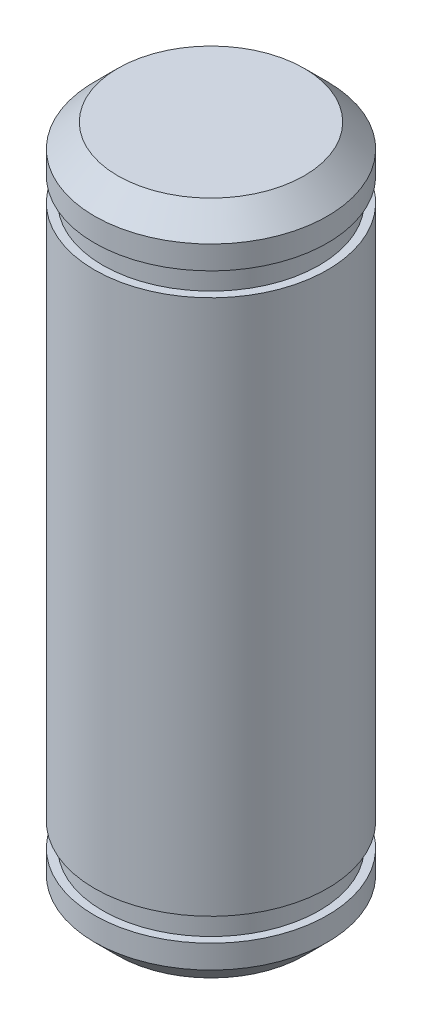
ISO-10303-21;
HEADER;
FILE_DESCRIPTION(('STEP AP214'),'2;1');
FILE_NAME('part.step','',(''),(''),'','','');
FILE_SCHEMA(('AUTOMOTIVE_DESIGN { 1 0 10303 214 1 1 1 1 }'));
ENDSEC;
DATA;
#1=APPLICATION_CONTEXT('core data for automotive mechanical design processes');
#2=APPLICATION_PROTOCOL_DEFINITION('international standard','automotive_design',2000,#1);
#3=PRODUCT_CONTEXT('',#1,'mechanical');
#4=PRODUCT('Part','Part','',(#3));
#5=PRODUCT_RELATED_PRODUCT_CATEGORY('part','',(#4));
#6=PRODUCT_DEFINITION_FORMATION('','',#4);
#7=PRODUCT_DEFINITION_CONTEXT('part definition',#1,'design');
#8=PRODUCT_DEFINITION('design','',#6,#7);
#9=PRODUCT_DEFINITION_SHAPE('','',#8);
#10=(LENGTH_UNIT() NAMED_UNIT(*) SI_UNIT(.MILLI.,.METRE.));
#11=(NAMED_UNIT(*) PLANE_ANGLE_UNIT() SI_UNIT($,.RADIAN.));
#12=(NAMED_UNIT(*) SI_UNIT($,.STERADIAN.) SOLID_ANGLE_UNIT());
#13=UNCERTAINTY_MEASURE_WITH_UNIT(LENGTH_MEASURE(1.E-05),#10,'distance_accuracy_value','');
#14=(GEOMETRIC_REPRESENTATION_CONTEXT(3) GLOBAL_UNCERTAINTY_ASSIGNED_CONTEXT((#13)) GLOBAL_UNIT_ASSIGNED_CONTEXT((#10,
#11,#12)) REPRESENTATION_CONTEXT('',''));
#15=CARTESIAN_POINT('',(0.,0.,0.));
#16=DIRECTION('',(0.,0.,1.));
#17=DIRECTION('',(1.,0.,0.));
#18=AXIS2_PLACEMENT_3D('',#15,#16,#17);
#19=CARTESIAN_POINT('',(0.,23.0736880055133,0.));
#20=DIRECTION('',(0.,1.,0.));
#21=DIRECTION('',(0.,0.,1.));
#22=AXIS2_PLACEMENT_3D('',#19,#20,#21);
#23=CYLINDRICAL_SURFACE('',#22,5.00000000000001);
#24=CARTESIAN_POINT('',(0.,13.,0.));
#25=DIRECTION('',(0.,1.,0.));
#26=DIRECTION('',(0.,0.,1.));
#27=AXIS2_PLACEMENT_3D('',#24,#25,#26);
#28=CIRCLE('',#27,5.00000000000001);
#29=CARTESIAN_POINT('',(0.,13.,5.00000000000001));
#30=VERTEX_POINT('',#29);
#31=EDGE_CURVE('E56',#30,#30,#28,.T.);
#32=ORIENTED_EDGE('',*,*,#31,.F.);
#33=EDGE_LOOP('',(#32));
#34=FACE_BOUND('',#33,.T.);
#35=CARTESIAN_POINT('',(0.,-10.,0.));
#36=DIRECTION('',(0.,1.,0.));
#37=DIRECTION('',(0.,0.,1.));
#38=AXIS2_PLACEMENT_3D('',#35,#36,#37);
#39=CIRCLE('',#38,5.00000000000001);
#40=CARTESIAN_POINT('',(0.,-10.,5.00000000000001));
#41=VERTEX_POINT('',#40);
#42=EDGE_CURVE('E66',#41,#41,#39,.T.);
#43=ORIENTED_EDGE('',*,*,#42,.T.);
#44=EDGE_LOOP('',(#43));
#45=FACE_BOUND('',#44,.T.);
#46=ADVANCED_FACE('F35',(#34,#45),#23,.T.);
#47=CARTESIAN_POINT('',(0.,13.,0.));
#48=DIRECTION('',(0.,1.,0.));
#49=DIRECTION('',(0.,0.,1.));
#50=AXIS2_PLACEMENT_3D('',#47,#48,#49);
#51=PLANE('',#50);
#52=CARTESIAN_POINT('',(0.,13.,0.));
#53=DIRECTION('',(0.,1.,0.));
#54=DIRECTION('',(0.,0.,1.));
#55=AXIS2_PLACEMENT_3D('',#52,#53,#54);
#56=CIRCLE('',#55,4.65);
#57=CARTESIAN_POINT('',(0.,13.,4.65));
#58=VERTEX_POINT('',#57);
#59=EDGE_CURVE('E60',#58,#58,#56,.T.);
#60=ORIENTED_EDGE('',*,*,#59,.F.);
#61=EDGE_LOOP('',(#60));
#62=FACE_BOUND('',#61,.T.);
#63=ORIENTED_EDGE('',*,*,#31,.T.);
#64=EDGE_LOOP('',(#63));
#65=FACE_BOUND('',#64,.T.);
#66=ADVANCED_FACE('F102',(#62,#65),#51,.T.);
#67=CARTESIAN_POINT('',(0.,14.,0.));
#68=DIRECTION('',(0.,1.,0.));
#69=DIRECTION('',(0.,0.,1.));
#70=AXIS2_PLACEMENT_3D('',#67,#68,#69);
#71=PLANE('',#70);
#72=CARTESIAN_POINT('',(0.,14.,0.));
#73=DIRECTION('',(0.,1.,0.));
#74=DIRECTION('',(0.,0.,1.));
#75=AXIS2_PLACEMENT_3D('',#72,#73,#74);
#76=CIRCLE('',#75,4.65);
#77=CARTESIAN_POINT('',(0.,14.,4.65));
#78=VERTEX_POINT('',#77);
#79=EDGE_CURVE('E63',#78,#78,#76,.T.);
#80=ORIENTED_EDGE('',*,*,#79,.T.);
#81=EDGE_LOOP('',(#80));
#82=FACE_BOUND('',#81,.T.);
#83=CARTESIAN_POINT('',(0.,14.,0.));
#84=DIRECTION('',(0.,1.,0.));
#85=DIRECTION('',(0.,0.,1.));
#86=AXIS2_PLACEMENT_3D('',#83,#84,#85);
#87=CIRCLE('',#86,5.00000000000001);
#88=CARTESIAN_POINT('',(0.,14.,5.00000000000001));
#89=VERTEX_POINT('',#88);
#90=EDGE_CURVE('E57',#89,#89,#87,.T.);
#91=ORIENTED_EDGE('',*,*,#90,.F.);
#92=EDGE_LOOP('',(#91));
#93=FACE_BOUND('',#92,.T.);
#94=ADVANCED_FACE('F109',(#82,#93),#71,.F.);
#95=CARTESIAN_POINT('',(0.,13.,0.));
#96=DIRECTION('',(0.,1.,0.));
#97=DIRECTION('',(0.,0.,1.));
#98=AXIS2_PLACEMENT_3D('',#95,#96,#97);
#99=CYLINDRICAL_SURFACE('',#98,4.65);
#100=ORIENTED_EDGE('',*,*,#59,.T.);
#101=EDGE_LOOP('',(#100));
#102=FACE_BOUND('',#101,.T.);
#103=ORIENTED_EDGE('',*,*,#79,.F.);
#104=EDGE_LOOP('',(#103));
#105=FACE_BOUND('',#104,.T.);
#106=ADVANCED_FACE('F132',(#102,#105),#99,.T.);
#107=CARTESIAN_POINT('',(0.,16.,0.));
#108=DIRECTION('',(0.,-1.,0.));
#109=DIRECTION('',(0.,0.,-1.));
#110=AXIS2_PLACEMENT_3D('',#107,#108,#109);
#111=PLANE('',#110);
#112=CARTESIAN_POINT('',(0.,16.,0.));
#113=DIRECTION('',(0.,-1.,0.));
#114=DIRECTION('',(0.,0.,-1.));
#115=AXIS2_PLACEMENT_3D('',#112,#113,#114);
#116=CIRCLE('',#115,4.00000000000001);
#117=CARTESIAN_POINT('',(0.,16.,-4.00000000000001));
#118=VERTEX_POINT('',#117);
#119=EDGE_CURVE('E10',#118,#118,#116,.F.);
#120=ORIENTED_EDGE('',*,*,#119,.T.);
#121=EDGE_LOOP('',(#120));
#122=FACE_BOUND('',#121,.T.);
#123=ADVANCED_FACE('F124',(#122),#111,.F.);
#124=CARTESIAN_POINT('',(0.,16.,0.));
#125=DIRECTION('',(0.,-1.,0.));
#126=DIRECTION('',(0.,0.,-1.));
#127=AXIS2_PLACEMENT_3D('',#124,#125,#126);
#128=CONICAL_SURFACE('',#127,4.00000000000001,0.785398163397449);
#129=CARTESIAN_POINT('',(0.,15.,0.));
#130=DIRECTION('',(0.,-1.,0.));
#131=DIRECTION('',(0.,0.,-1.));
#132=AXIS2_PLACEMENT_3D('',#129,#130,#131);
#133=CIRCLE('',#132,5.00000000000001);
#134=CARTESIAN_POINT('',(0.,15.,-5.00000000000001));
#135=VERTEX_POINT('',#134);
#136=EDGE_CURVE('E51',#135,#135,#133,.T.);
#137=ORIENTED_EDGE('',*,*,#136,.F.);
#138=EDGE_LOOP('',(#137));
#139=FACE_BOUND('',#138,.T.);
#140=ORIENTED_EDGE('',*,*,#119,.F.);
#141=EDGE_LOOP('',(#140));
#142=FACE_BOUND('',#141,.T.);
#143=ADVANCED_FACE('F38',(#139,#142),#128,.T.);
#144=ORIENTED_EDGE('',*,*,#90,.T.);
#145=EDGE_LOOP('',(#144));
#146=FACE_BOUND('',#145,.T.);
#147=ORIENTED_EDGE('',*,*,#136,.T.);
#148=EDGE_LOOP('',(#147));
#149=FACE_BOUND('',#148,.T.);
#150=ADVANCED_FACE('F97',(#146,#149),#23,.T.);
#151=CARTESIAN_POINT('',(0.,-10.,0.));
#152=DIRECTION('',(0.,-1.,0.));
#153=DIRECTION('',(0.,0.,1.));
#154=AXIS2_PLACEMENT_3D('',#151,#152,#153);
#155=PLANE('',#154);
#156=ORIENTED_EDGE('',*,*,#42,.F.);
#157=EDGE_LOOP('',(#156));
#158=FACE_BOUND('',#157,.T.);
#159=CARTESIAN_POINT('',(0.,-10.,0.));
#160=DIRECTION('',(0.,1.,0.));
#161=DIRECTION('',(0.,0.,1.));
#162=AXIS2_PLACEMENT_3D('',#159,#160,#161);
#163=CIRCLE('',#162,4.65);
#164=CARTESIAN_POINT('',(0.,-10.,4.65));
#165=VERTEX_POINT('',#164);
#166=EDGE_CURVE('E72',#165,#165,#163,.T.);
#167=ORIENTED_EDGE('',*,*,#166,.T.);
#168=EDGE_LOOP('',(#167));
#169=FACE_BOUND('',#168,.T.);
#170=ADVANCED_FACE('F81',(#158,#169),#155,.T.);
#171=CARTESIAN_POINT('',(0.,-11.,0.));
#172=DIRECTION('',(0.,-1.,0.));
#173=DIRECTION('',(0.,0.,1.));
#174=AXIS2_PLACEMENT_3D('',#171,#172,#173);
#175=PLANE('',#174);
#176=CARTESIAN_POINT('',(0.,-11.,0.));
#177=DIRECTION('',(0.,1.,0.));
#178=DIRECTION('',(0.,0.,1.));
#179=AXIS2_PLACEMENT_3D('',#176,#177,#178);
#180=CIRCLE('',#179,5.00000000000001);
#181=CARTESIAN_POINT('',(0.,-11.,5.00000000000001));
#182=VERTEX_POINT('',#181);
#183=EDGE_CURVE('E69',#182,#182,#180,.T.);
#184=ORIENTED_EDGE('',*,*,#183,.T.);
#185=EDGE_LOOP('',(#184));
#186=FACE_BOUND('',#185,.T.);
#187=CARTESIAN_POINT('',(0.,-11.,0.));
#188=DIRECTION('',(0.,1.,0.));
#189=DIRECTION('',(0.,0.,1.));
#190=AXIS2_PLACEMENT_3D('',#187,#188,#189);
#191=CIRCLE('',#190,4.65);
#192=CARTESIAN_POINT('',(0.,-11.,4.65));
#193=VERTEX_POINT('',#192);
#194=EDGE_CURVE('E75',#193,#193,#191,.T.);
#195=ORIENTED_EDGE('',*,*,#194,.F.);
#196=EDGE_LOOP('',(#195));
#197=FACE_BOUND('',#196,.T.);
#198=ADVANCED_FACE('F87',(#186,#197),#175,.F.);
#199=CARTESIAN_POINT('',(0.,-10.,0.));
#200=DIRECTION('',(0.,-1.,0.));
#201=DIRECTION('',(0.,0.,-1.));
#202=AXIS2_PLACEMENT_3D('',#199,#200,#201);
#203=CYLINDRICAL_SURFACE('',#202,4.65);
#204=ORIENTED_EDGE('',*,*,#166,.F.);
#205=EDGE_LOOP('',(#204));
#206=FACE_BOUND('',#205,.T.);
#207=ORIENTED_EDGE('',*,*,#194,.T.);
#208=EDGE_LOOP('',(#207));
#209=FACE_BOUND('',#208,.T.);
#210=ADVANCED_FACE('F83',(#206,#209),#203,.T.);
#211=CARTESIAN_POINT('',(5.00000000000001,-13.,0.));
#212=DIRECTION('',(0.,1.,0.));
#213=DIRECTION('',(0.,0.,1.));
#214=AXIS2_PLACEMENT_3D('',#211,#212,#213);
#215=PLANE('',#214);
#216=CARTESIAN_POINT('',(0.,-13.,0.));
#217=DIRECTION('',(0.,1.,0.));
#218=DIRECTION('',(0.,0.,1.));
#219=AXIS2_PLACEMENT_3D('',#216,#217,#218);
#220=CIRCLE('',#219,4.);
#221=CARTESIAN_POINT('',(0.,-13.,4.));
#222=VERTEX_POINT('',#221);
#223=EDGE_CURVE('E43',#222,#222,#220,.F.);
#224=ORIENTED_EDGE('',*,*,#223,.T.);
#225=EDGE_LOOP('',(#224));
#226=FACE_BOUND('',#225,.T.);
#227=ADVANCED_FACE('F86',(#226),#215,.F.);
#228=CARTESIAN_POINT('',(0.,-12.,0.));
#229=DIRECTION('',(0.,1.,0.));
#230=DIRECTION('',(0.,0.,1.));
#231=AXIS2_PLACEMENT_3D('',#228,#229,#230);
#232=CONICAL_SURFACE('',#231,5.00000000000001,0.785398163397449);
#233=ORIENTED_EDGE('',*,*,#223,.F.);
#234=EDGE_LOOP('',(#233));
#235=FACE_BOUND('',#234,.T.);
#236=CARTESIAN_POINT('',(0.,-12.,0.));
#237=DIRECTION('',(0.,1.,0.));
#238=DIRECTION('',(0.,0.,1.));
#239=AXIS2_PLACEMENT_3D('',#236,#237,#238);
#240=CIRCLE('',#239,5.00000000000001);
#241=CARTESIAN_POINT('',(0.,-12.,5.00000000000001));
#242=VERTEX_POINT('',#241);
#243=EDGE_CURVE('E47',#242,#242,#240,.T.);
#244=ORIENTED_EDGE('',*,*,#243,.F.);
#245=EDGE_LOOP('',(#244));
#246=FACE_BOUND('',#245,.T.);
#247=ADVANCED_FACE('F117',(#235,#246),#232,.T.);
#248=ORIENTED_EDGE('',*,*,#183,.F.);
#249=EDGE_LOOP('',(#248));
#250=FACE_BOUND('',#249,.T.);
#251=ORIENTED_EDGE('',*,*,#243,.T.);
#252=EDGE_LOOP('',(#251));
#253=FACE_BOUND('',#252,.T.);
#254=ADVANCED_FACE('F105',(#250,#253),#23,.T.);
#255=CLOSED_SHELL('',(#46,#66,#94,#106,#123,#143,#150,#170,#198,#210,#227,#247,#254));
#256=MANIFOLD_SOLID_BREP('B2',#255);
#257=ADVANCED_BREP_SHAPE_REPRESENTATION('',(#18,#256),#14);
#258=SHAPE_DEFINITION_REPRESENTATION(#9,#257);
ENDSEC;
END-ISO-10303-21;
